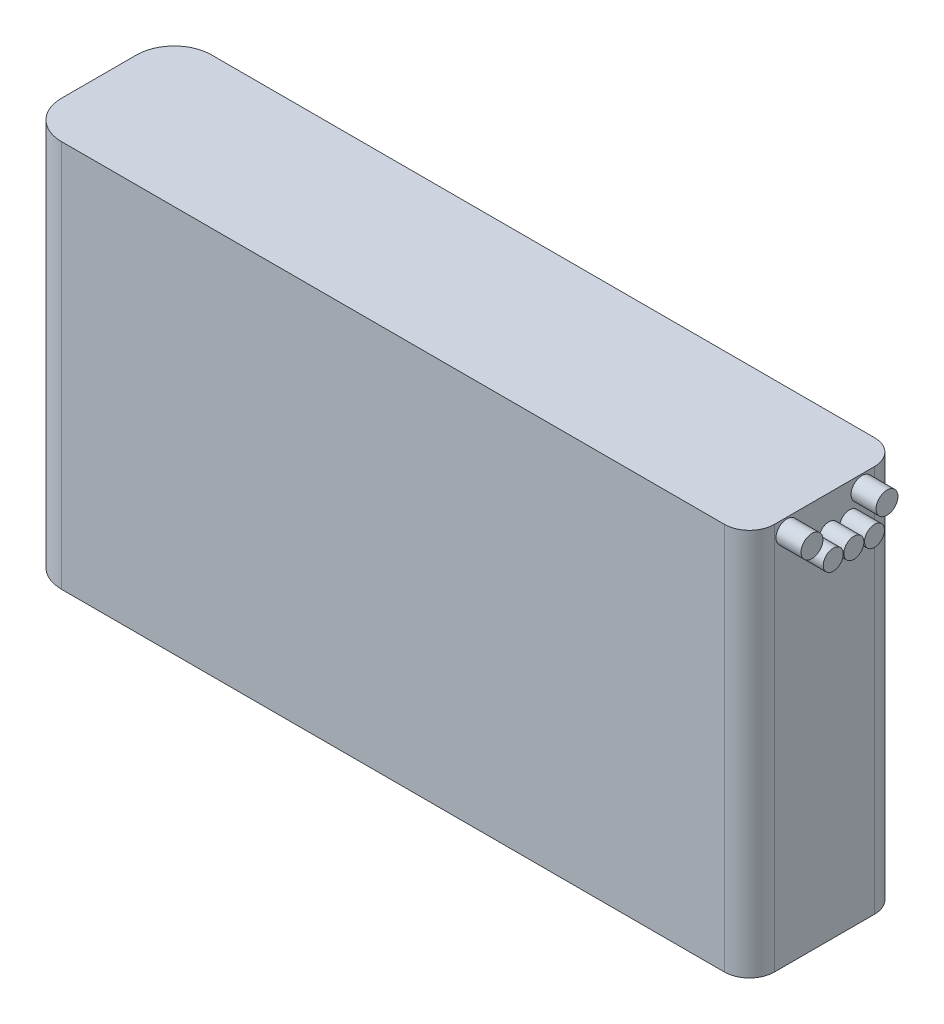
ISO-10303-21;
HEADER;
FILE_DESCRIPTION(('STEP AP214'),'2;1');
FILE_NAME('part.step','',(''),(''),'','','');
FILE_SCHEMA(('AUTOMOTIVE_DESIGN { 1 0 10303 214 1 1 1 1 }'));
ENDSEC;
DATA;
#1=APPLICATION_CONTEXT('core data for automotive mechanical design processes');
#2=APPLICATION_PROTOCOL_DEFINITION('international standard','automotive_design',2000,#1);
#3=PRODUCT_CONTEXT('',#1,'mechanical');
#4=PRODUCT('Part','Part','',(#3));
#5=PRODUCT_RELATED_PRODUCT_CATEGORY('part','',(#4));
#6=PRODUCT_DEFINITION_FORMATION('','',#4);
#7=PRODUCT_DEFINITION_CONTEXT('part definition',#1,'design');
#8=PRODUCT_DEFINITION('design','',#6,#7);
#9=PRODUCT_DEFINITION_SHAPE('','',#8);
#10=(LENGTH_UNIT() NAMED_UNIT(*) SI_UNIT(.MILLI.,.METRE.));
#11=(NAMED_UNIT(*) PLANE_ANGLE_UNIT() SI_UNIT($,.RADIAN.));
#12=(NAMED_UNIT(*) SI_UNIT($,.STERADIAN.) SOLID_ANGLE_UNIT());
#13=UNCERTAINTY_MEASURE_WITH_UNIT(LENGTH_MEASURE(1.E-05),#10,'distance_accuracy_value','');
#14=(GEOMETRIC_REPRESENTATION_CONTEXT(3) GLOBAL_UNCERTAINTY_ASSIGNED_CONTEXT((#13)) GLOBAL_UNIT_ASSIGNED_CONTEXT((#10,
#11,#12)) REPRESENTATION_CONTEXT('',''));
#15=CARTESIAN_POINT('',(0.,0.,0.));
#16=DIRECTION('',(0.,0.,1.));
#17=DIRECTION('',(1.,0.,0.));
#18=AXIS2_PLACEMENT_3D('',#15,#16,#17);
#19=CARTESIAN_POINT('',(0.,0.,12.));
#20=DIRECTION('',(1.,0.,0.));
#21=DIRECTION('',(0.,0.,-1.));
#22=AXIS2_PLACEMENT_3D('',#19,#20,#21);
#23=PLANE('',#22);
#24=DIRECTION('',(0.,0.,-1.));
#25=VECTOR('',#24,1.);
#26=CARTESIAN_POINT('',(0.,0.,12.));
#27=LINE('',#26,#25);
#28=CARTESIAN_POINT('',(0.,0.,9.));
#29=VERTEX_POINT('',#28);
#30=CARTESIAN_POINT('',(0.,0.,3.));
#31=VERTEX_POINT('',#30);
#32=EDGE_CURVE('E137',#29,#31,#27,.T.);
#33=ORIENTED_EDGE('',*,*,#32,.F.);
#34=DIRECTION('',(0.,-1.,0.));
#35=VECTOR('',#34,1.);
#36=CARTESIAN_POINT('',(0.,0.,9.));
#37=LINE('',#36,#35);
#38=CARTESIAN_POINT('',(0.,31.,9.));
#39=VERTEX_POINT('',#38);
#40=EDGE_CURVE('E174',#29,#39,#37,.F.);
#41=ORIENTED_EDGE('',*,*,#40,.T.);
#42=DIRECTION('',(0.,0.,-1.));
#43=VECTOR('',#42,1.);
#44=CARTESIAN_POINT('',(0.,31.,12.));
#45=LINE('',#44,#43);
#46=CARTESIAN_POINT('',(0.,31.,3.));
#47=VERTEX_POINT('',#46);
#48=EDGE_CURVE('E130',#39,#47,#45,.T.);
#49=ORIENTED_EDGE('',*,*,#48,.T.);
#50=DIRECTION('',(0.,-1.,0.));
#51=VECTOR('',#50,1.);
#52=CARTESIAN_POINT('',(0.,0.,3.));
#53=LINE('',#52,#51);
#54=EDGE_CURVE('E170',#47,#31,#53,.T.);
#55=ORIENTED_EDGE('',*,*,#54,.T.);
#56=EDGE_LOOP('',(#33,#41,#49,#55));
#57=FACE_BOUND('',#56,.T.);
#58=ADVANCED_FACE('F39',(#57),#23,.F.);
#59=CARTESIAN_POINT('',(0.,0.,12.));
#60=DIRECTION('',(0.,1.,0.));
#61=DIRECTION('',(0.,0.,1.));
#62=AXIS2_PLACEMENT_3D('',#59,#60,#61);
#63=PLANE('',#62);
#64=DIRECTION('',(1.,0.,0.));
#65=VECTOR('',#64,1.);
#66=CARTESIAN_POINT('',(0.,0.,12.));
#67=LINE('',#66,#65);
#68=CARTESIAN_POINT('',(3.,0.,12.));
#69=VERTEX_POINT('',#68);
#70=CARTESIAN_POINT('',(56.,0.,12.));
#71=VERTEX_POINT('',#70);
#72=EDGE_CURVE('E255',#69,#71,#67,.T.);
#73=ORIENTED_EDGE('',*,*,#72,.F.);
#74=CARTESIAN_POINT('',(3.,0.,9.));
#75=DIRECTION('',(0.,1.,0.));
#76=DIRECTION('',(0.,0.,1.));
#77=AXIS2_PLACEMENT_3D('',#74,#75,#76);
#78=CIRCLE('',#77,3.);
#79=EDGE_CURVE('E167',#69,#29,#78,.F.);
#80=ORIENTED_EDGE('',*,*,#79,.T.);
#81=ORIENTED_EDGE('',*,*,#32,.T.);
#82=CARTESIAN_POINT('',(3.,0.,3.));
#83=DIRECTION('',(0.,1.,0.));
#84=DIRECTION('',(0.,0.,1.));
#85=AXIS2_PLACEMENT_3D('',#82,#83,#84);
#86=CIRCLE('',#85,3.);
#87=CARTESIAN_POINT('',(3.,0.,0.));
#88=VERTEX_POINT('',#87);
#89=EDGE_CURVE('E164',#31,#88,#86,.F.);
#90=ORIENTED_EDGE('',*,*,#89,.T.);
#91=DIRECTION('',(1.,0.,0.));
#92=VECTOR('',#91,1.);
#93=CARTESIAN_POINT('',(0.,0.,0.));
#94=LINE('',#93,#92);
#95=CARTESIAN_POINT('',(56.,0.,0.));
#96=VERTEX_POINT('',#95);
#97=EDGE_CURVE('E264',#88,#96,#94,.T.);
#98=ORIENTED_EDGE('',*,*,#97,.T.);
#99=CARTESIAN_POINT('',(56.,0.,2.));
#100=DIRECTION('',(0.,1.,0.));
#101=DIRECTION('',(0.,0.,1.));
#102=AXIS2_PLACEMENT_3D('',#99,#100,#101);
#103=CIRCLE('',#102,2.);
#104=CARTESIAN_POINT('',(58.,0.,2.));
#105=VERTEX_POINT('',#104);
#106=EDGE_CURVE('E154',#96,#105,#103,.F.);
#107=ORIENTED_EDGE('',*,*,#106,.T.);
#108=DIRECTION('',(0.,0.,-1.));
#109=VECTOR('',#108,1.);
#110=CARTESIAN_POINT('',(58.,0.,12.));
#111=LINE('',#110,#109);
#112=CARTESIAN_POINT('',(58.,0.,10.));
#113=VERTEX_POINT('',#112);
#114=EDGE_CURVE('E129',#113,#105,#111,.T.);
#115=ORIENTED_EDGE('',*,*,#114,.F.);
#116=CARTESIAN_POINT('',(56.,0.,10.));
#117=DIRECTION('',(0.,1.,0.));
#118=DIRECTION('',(0.,0.,1.));
#119=AXIS2_PLACEMENT_3D('',#116,#117,#118);
#120=CIRCLE('',#119,2.);
#121=EDGE_CURVE('E135',#113,#71,#120,.F.);
#122=ORIENTED_EDGE('',*,*,#121,.T.);
#123=EDGE_LOOP('',(#73,#80,#81,#90,#98,#107,#115,#122));
#124=FACE_BOUND('',#123,.T.);
#125=ADVANCED_FACE('F203',(#124),#63,.F.);
#126=CARTESIAN_POINT('',(58.,0.,12.));
#127=DIRECTION('',(-1.,0.,0.));
#128=DIRECTION('',(0.,0.,1.));
#129=AXIS2_PLACEMENT_3D('',#126,#127,#128);
#130=PLANE('',#129);
#131=CARTESIAN_POINT('',(58.,28.2,7.3));
#132=DIRECTION('',(-1.,0.,0.));
#133=DIRECTION('',(0.,0.,1.));
#134=AXIS2_PLACEMENT_3D('',#131,#132,#133);
#135=CIRCLE('',#134,0.799999999999999);
#136=CARTESIAN_POINT('',(58.,28.2,8.1));
#137=VERTEX_POINT('',#136);
#138=EDGE_CURVE('E11',#137,#137,#135,.F.);
#139=ORIENTED_EDGE('',*,*,#138,.F.);
#140=EDGE_LOOP('',(#139));
#141=FACE_BOUND('',#140,.T.);
#142=CARTESIAN_POINT('',(58.,28.2,4.));
#143=DIRECTION('',(-1.,0.,0.));
#144=DIRECTION('',(0.,0.,1.));
#145=AXIS2_PLACEMENT_3D('',#142,#143,#144);
#146=CIRCLE('',#145,0.799999999999997);
#147=CARTESIAN_POINT('',(58.,28.2,4.8));
#148=VERTEX_POINT('',#147);
#149=EDGE_CURVE('E48',#148,#148,#146,.F.);
#150=ORIENTED_EDGE('',*,*,#149,.F.);
#151=EDGE_LOOP('',(#150));
#152=FACE_BOUND('',#151,.T.);
#153=CARTESIAN_POINT('',(58.,28.2,5.65));
#154=DIRECTION('',(-1.,0.,0.));
#155=DIRECTION('',(0.,0.,1.));
#156=AXIS2_PLACEMENT_3D('',#153,#154,#155);
#157=CIRCLE('',#156,0.799999999999998);
#158=CARTESIAN_POINT('',(58.,28.2,6.45));
#159=VERTEX_POINT('',#158);
#160=EDGE_CURVE('E192',#159,#159,#157,.F.);
#161=ORIENTED_EDGE('',*,*,#160,.F.);
#162=EDGE_LOOP('',(#161));
#163=FACE_BOUND('',#162,.T.);
#164=CARTESIAN_POINT('',(58.,30.,3.));
#165=DIRECTION('',(-1.,0.,0.));
#166=DIRECTION('',(0.,0.,1.));
#167=AXIS2_PLACEMENT_3D('',#164,#165,#166);
#168=CIRCLE('',#167,0.875000000000002);
#169=CARTESIAN_POINT('',(58.,30.,3.875));
#170=VERTEX_POINT('',#169);
#171=EDGE_CURVE('E188',#170,#170,#168,.F.);
#172=ORIENTED_EDGE('',*,*,#171,.F.);
#173=EDGE_LOOP('',(#172));
#174=FACE_BOUND('',#173,.T.);
#175=CARTESIAN_POINT('',(58.,30.,9.));
#176=DIRECTION('',(-1.,0.,0.));
#177=DIRECTION('',(0.,0.,1.));
#178=AXIS2_PLACEMENT_3D('',#175,#176,#177);
#179=CIRCLE('',#178,0.875);
#180=CARTESIAN_POINT('',(58.,30.,9.875));
#181=VERTEX_POINT('',#180);
#182=EDGE_CURVE('E184',#181,#181,#179,.F.);
#183=ORIENTED_EDGE('',*,*,#182,.F.);
#184=EDGE_LOOP('',(#183));
#185=FACE_BOUND('',#184,.T.);
#186=ORIENTED_EDGE('',*,*,#114,.T.);
#187=DIRECTION('',(0.,1.,0.));
#188=VECTOR('',#187,1.);
#189=CARTESIAN_POINT('',(58.,31.,2.));
#190=LINE('',#189,#188);
#191=CARTESIAN_POINT('',(58.,31.,2.));
#192=VERTEX_POINT('',#191);
#193=EDGE_CURVE('E119',#105,#192,#190,.T.);
#194=ORIENTED_EDGE('',*,*,#193,.T.);
#195=DIRECTION('',(0.,0.,-1.));
#196=VECTOR('',#195,1.);
#197=CARTESIAN_POINT('',(58.,31.,12.));
#198=LINE('',#197,#196);
#199=CARTESIAN_POINT('',(58.,31.,10.));
#200=VERTEX_POINT('',#199);
#201=EDGE_CURVE('E110',#200,#192,#198,.T.);
#202=ORIENTED_EDGE('',*,*,#201,.F.);
#203=DIRECTION('',(0.,1.,0.));
#204=VECTOR('',#203,1.);
#205=CARTESIAN_POINT('',(58.,0.,10.));
#206=LINE('',#205,#204);
#207=EDGE_CURVE('E125',#200,#113,#206,.F.);
#208=ORIENTED_EDGE('',*,*,#207,.T.);
#209=EDGE_LOOP('',(#186,#194,#202,#208));
#210=FACE_BOUND('',#209,.T.);
#211=ADVANCED_FACE('F124',(#141,#152,#163,#174,#185,#210),#130,.F.);
#212=CARTESIAN_POINT('',(0.,31.,12.));
#213=DIRECTION('',(0.,-1.,0.));
#214=DIRECTION('',(0.,0.,-1.));
#215=AXIS2_PLACEMENT_3D('',#212,#213,#214);
#216=PLANE('',#215);
#217=ORIENTED_EDGE('',*,*,#48,.F.);
#218=CARTESIAN_POINT('',(3.,31.,9.));
#219=DIRECTION('',(0.,-1.,0.));
#220=DIRECTION('',(0.,0.,-1.));
#221=AXIS2_PLACEMENT_3D('',#218,#219,#220);
#222=CIRCLE('',#221,3.);
#223=CARTESIAN_POINT('',(3.,31.,12.));
#224=VERTEX_POINT('',#223);
#225=EDGE_CURVE('E179',#39,#224,#222,.F.);
#226=ORIENTED_EDGE('',*,*,#225,.T.);
#227=DIRECTION('',(-1.,0.,0.));
#228=VECTOR('',#227,1.);
#229=CARTESIAN_POINT('',(0.,31.,12.));
#230=LINE('',#229,#228);
#231=CARTESIAN_POINT('',(56.,31.,12.));
#232=VERTEX_POINT('',#231);
#233=EDGE_CURVE('E112',#232,#224,#230,.T.);
#234=ORIENTED_EDGE('',*,*,#233,.F.);
#235=CARTESIAN_POINT('',(56.,31.,10.));
#236=DIRECTION('',(0.,-1.,0.));
#237=DIRECTION('',(0.,0.,-1.));
#238=AXIS2_PLACEMENT_3D('',#235,#236,#237);
#239=CIRCLE('',#238,2.);
#240=EDGE_CURVE('E107',#232,#200,#239,.F.);
#241=ORIENTED_EDGE('',*,*,#240,.T.);
#242=ORIENTED_EDGE('',*,*,#201,.T.);
#243=CARTESIAN_POINT('',(56.,31.,2.));
#244=DIRECTION('',(0.,-1.,0.));
#245=DIRECTION('',(0.,0.,-1.));
#246=AXIS2_PLACEMENT_3D('',#243,#244,#245);
#247=CIRCLE('',#246,2.);
#248=CARTESIAN_POINT('',(56.,31.,0.));
#249=VERTEX_POINT('',#248);
#250=EDGE_CURVE('E118',#192,#249,#247,.F.);
#251=ORIENTED_EDGE('',*,*,#250,.T.);
#252=DIRECTION('',(-1.,0.,0.));
#253=VECTOR('',#252,1.);
#254=CARTESIAN_POINT('',(0.,31.,0.));
#255=LINE('',#254,#253);
#256=CARTESIAN_POINT('',(3.,31.,0.));
#257=VERTEX_POINT('',#256);
#258=EDGE_CURVE('E260',#249,#257,#255,.T.);
#259=ORIENTED_EDGE('',*,*,#258,.T.);
#260=CARTESIAN_POINT('',(3.,31.,3.));
#261=DIRECTION('',(0.,-1.,0.));
#262=DIRECTION('',(0.,0.,-1.));
#263=AXIS2_PLACEMENT_3D('',#260,#261,#262);
#264=CIRCLE('',#263,3.);
#265=EDGE_CURVE('E62',#257,#47,#264,.F.);
#266=ORIENTED_EDGE('',*,*,#265,.T.);
#267=EDGE_LOOP('',(#217,#226,#234,#241,#242,#251,#259,#266));
#268=FACE_BOUND('',#267,.T.);
#269=ADVANCED_FACE('F109',(#268),#216,.F.);
#270=CARTESIAN_POINT('',(0.,0.,12.));
#271=DIRECTION('',(0.,0.,-1.));
#272=DIRECTION('',(-1.,0.,0.));
#273=AXIS2_PLACEMENT_3D('',#270,#271,#272);
#274=PLANE('',#273);
#275=ORIENTED_EDGE('',*,*,#233,.T.);
#276=DIRECTION('',(0.,-1.,0.));
#277=VECTOR('',#276,1.);
#278=CARTESIAN_POINT('',(3.,0.,12.));
#279=LINE('',#278,#277);
#280=EDGE_CURVE('E160',#224,#69,#279,.T.);
#281=ORIENTED_EDGE('',*,*,#280,.T.);
#282=ORIENTED_EDGE('',*,*,#72,.T.);
#283=DIRECTION('',(0.,1.,0.));
#284=VECTOR('',#283,1.);
#285=CARTESIAN_POINT('',(56.,0.,12.));
#286=LINE('',#285,#284);
#287=EDGE_CURVE('E157',#71,#232,#286,.T.);
#288=ORIENTED_EDGE('',*,*,#287,.T.);
#289=EDGE_LOOP('',(#275,#281,#282,#288));
#290=FACE_BOUND('',#289,.T.);
#291=ADVANCED_FACE('F252',(#290),#274,.F.);
#292=CARTESIAN_POINT('',(0.,0.,0.));
#293=DIRECTION('',(0.,0.,-1.));
#294=DIRECTION('',(-1.,0.,0.));
#295=AXIS2_PLACEMENT_3D('',#292,#293,#294);
#296=PLANE('',#295);
#297=ORIENTED_EDGE('',*,*,#97,.F.);
#298=DIRECTION('',(0.,-1.,0.));
#299=VECTOR('',#298,1.);
#300=CARTESIAN_POINT('',(3.,31.,0.));
#301=LINE('',#300,#299);
#302=EDGE_CURVE('E55',#88,#257,#301,.F.);
#303=ORIENTED_EDGE('',*,*,#302,.T.);
#304=ORIENTED_EDGE('',*,*,#258,.F.);
#305=DIRECTION('',(0.,1.,0.));
#306=VECTOR('',#305,1.);
#307=CARTESIAN_POINT('',(56.,0.,0.));
#308=LINE('',#307,#306);
#309=EDGE_CURVE('E148',#249,#96,#308,.F.);
#310=ORIENTED_EDGE('',*,*,#309,.T.);
#311=EDGE_LOOP('',(#297,#303,#304,#310));
#312=FACE_BOUND('',#311,.T.);
#313=ADVANCED_FACE('F241',(#312),#296,.T.);
#314=CARTESIAN_POINT('',(56.,0.,2.));
#315=DIRECTION('',(0.,-1.,0.));
#316=DIRECTION('',(0.,0.,-1.));
#317=AXIS2_PLACEMENT_3D('',#314,#315,#316);
#318=CYLINDRICAL_SURFACE('',#317,2.);
#319=ORIENTED_EDGE('',*,*,#106,.F.);
#320=ORIENTED_EDGE('',*,*,#309,.F.);
#321=ORIENTED_EDGE('',*,*,#250,.F.);
#322=ORIENTED_EDGE('',*,*,#193,.F.);
#323=EDGE_LOOP('',(#319,#320,#321,#322));
#324=FACE_BOUND('',#323,.T.);
#325=ADVANCED_FACE('F238',(#324),#318,.T.);
#326=CARTESIAN_POINT('',(56.,0.,10.));
#327=DIRECTION('',(0.,1.,0.));
#328=DIRECTION('',(0.,0.,1.));
#329=AXIS2_PLACEMENT_3D('',#326,#327,#328);
#330=CYLINDRICAL_SURFACE('',#329,2.);
#331=ORIENTED_EDGE('',*,*,#121,.F.);
#332=ORIENTED_EDGE('',*,*,#207,.F.);
#333=ORIENTED_EDGE('',*,*,#240,.F.);
#334=ORIENTED_EDGE('',*,*,#287,.F.);
#335=EDGE_LOOP('',(#331,#332,#333,#334));
#336=FACE_BOUND('',#335,.T.);
#337=ADVANCED_FACE('F133',(#336),#330,.T.);
#338=CARTESIAN_POINT('',(3.,0.,9.));
#339=DIRECTION('',(0.,-1.,0.));
#340=DIRECTION('',(0.,0.,-1.));
#341=AXIS2_PLACEMENT_3D('',#338,#339,#340);
#342=CYLINDRICAL_SURFACE('',#341,3.);
#343=ORIENTED_EDGE('',*,*,#225,.F.);
#344=ORIENTED_EDGE('',*,*,#40,.F.);
#345=ORIENTED_EDGE('',*,*,#79,.F.);
#346=ORIENTED_EDGE('',*,*,#280,.F.);
#347=EDGE_LOOP('',(#343,#344,#345,#346));
#348=FACE_BOUND('',#347,.T.);
#349=ADVANCED_FACE('F224',(#348),#342,.T.);
#350=CARTESIAN_POINT('',(3.,0.,3.));
#351=DIRECTION('',(0.,1.,0.));
#352=DIRECTION('',(0.,0.,1.));
#353=AXIS2_PLACEMENT_3D('',#350,#351,#352);
#354=CYLINDRICAL_SURFACE('',#353,3.);
#355=ORIENTED_EDGE('',*,*,#265,.F.);
#356=ORIENTED_EDGE('',*,*,#302,.F.);
#357=ORIENTED_EDGE('',*,*,#89,.F.);
#358=ORIENTED_EDGE('',*,*,#54,.F.);
#359=EDGE_LOOP('',(#355,#356,#357,#358));
#360=FACE_BOUND('',#359,.T.);
#361=ADVANCED_FACE('F41',(#360),#354,.T.);
#362=CARTESIAN_POINT('',(60.,30.,9.));
#363=DIRECTION('',(-1.,0.,0.));
#364=DIRECTION('',(0.,0.,1.));
#365=AXIS2_PLACEMENT_3D('',#362,#363,#364);
#366=CYLINDRICAL_SURFACE('',#365,0.875);
#367=CARTESIAN_POINT('',(60.,30.,9.));
#368=DIRECTION('',(1.,0.,0.));
#369=DIRECTION('',(0.,0.,-1.));
#370=AXIS2_PLACEMENT_3D('',#367,#368,#369);
#371=CIRCLE('',#370,0.875);
#372=CARTESIAN_POINT('',(60.,30.,8.125));
#373=VERTEX_POINT('',#372);
#374=EDGE_CURVE('E267',#373,#373,#371,.T.);
#375=ORIENTED_EDGE('',*,*,#374,.F.);
#376=EDGE_LOOP('',(#375));
#377=FACE_BOUND('',#376,.T.);
#378=ORIENTED_EDGE('',*,*,#182,.T.);
#379=EDGE_LOOP('',(#378));
#380=FACE_BOUND('',#379,.T.);
#381=ADVANCED_FACE('F212',(#377,#380),#366,.T.);
#382=CARTESIAN_POINT('',(60.,30.,9.));
#383=DIRECTION('',(1.,0.,0.));
#384=DIRECTION('',(0.,0.,-1.));
#385=AXIS2_PLACEMENT_3D('',#382,#383,#384);
#386=PLANE('',#385);
#387=ORIENTED_EDGE('',*,*,#374,.T.);
#388=EDGE_LOOP('',(#387));
#389=FACE_BOUND('',#388,.T.);
#390=ADVANCED_FACE('F214',(#389),#386,.T.);
#391=CARTESIAN_POINT('',(60.,30.,3.));
#392=DIRECTION('',(-1.,0.,0.));
#393=DIRECTION('',(0.,0.,1.));
#394=AXIS2_PLACEMENT_3D('',#391,#392,#393);
#395=CYLINDRICAL_SURFACE('',#394,0.875000000000002);
#396=CARTESIAN_POINT('',(60.,30.,3.));
#397=DIRECTION('',(1.,0.,0.));
#398=DIRECTION('',(0.,0.,-1.));
#399=AXIS2_PLACEMENT_3D('',#396,#397,#398);
#400=CIRCLE('',#399,0.875000000000002);
#401=CARTESIAN_POINT('',(60.,30.,2.125));
#402=VERTEX_POINT('',#401);
#403=EDGE_CURVE('E416',#402,#402,#400,.T.);
#404=ORIENTED_EDGE('',*,*,#403,.F.);
#405=EDGE_LOOP('',(#404));
#406=FACE_BOUND('',#405,.T.);
#407=ORIENTED_EDGE('',*,*,#171,.T.);
#408=EDGE_LOOP('',(#407));
#409=FACE_BOUND('',#408,.T.);
#410=ADVANCED_FACE('F221',(#406,#409),#395,.T.);
#411=CARTESIAN_POINT('',(60.,30.,3.));
#412=DIRECTION('',(1.,0.,0.));
#413=DIRECTION('',(0.,0.,-1.));
#414=AXIS2_PLACEMENT_3D('',#411,#412,#413);
#415=PLANE('',#414);
#416=ORIENTED_EDGE('',*,*,#403,.T.);
#417=EDGE_LOOP('',(#416));
#418=FACE_BOUND('',#417,.T.);
#419=ADVANCED_FACE('F329',(#418),#415,.T.);
#420=CARTESIAN_POINT('',(60.,28.2,5.65));
#421=DIRECTION('',(-1.,0.,0.));
#422=DIRECTION('',(0.,0.,1.));
#423=AXIS2_PLACEMENT_3D('',#420,#421,#422);
#424=CYLINDRICAL_SURFACE('',#423,0.799999999999998);
#425=CARTESIAN_POINT('',(60.,28.2,5.65));
#426=DIRECTION('',(1.,0.,0.));
#427=DIRECTION('',(0.,0.,-1.));
#428=AXIS2_PLACEMENT_3D('',#425,#426,#427);
#429=CIRCLE('',#428,0.799999999999998);
#430=CARTESIAN_POINT('',(60.,28.2,4.85));
#431=VERTEX_POINT('',#430);
#432=EDGE_CURVE('E410',#431,#431,#429,.T.);
#433=ORIENTED_EDGE('',*,*,#432,.F.);
#434=EDGE_LOOP('',(#433));
#435=FACE_BOUND('',#434,.T.);
#436=ORIENTED_EDGE('',*,*,#160,.T.);
#437=EDGE_LOOP('',(#436));
#438=FACE_BOUND('',#437,.T.);
#439=ADVANCED_FACE('F339',(#435,#438),#424,.T.);
#440=CARTESIAN_POINT('',(60.,28.2,5.65));
#441=DIRECTION('',(1.,0.,0.));
#442=DIRECTION('',(0.,0.,-1.));
#443=AXIS2_PLACEMENT_3D('',#440,#441,#442);
#444=PLANE('',#443);
#445=ORIENTED_EDGE('',*,*,#432,.T.);
#446=EDGE_LOOP('',(#445));
#447=FACE_BOUND('',#446,.T.);
#448=ADVANCED_FACE('F349',(#447),#444,.T.);
#449=CARTESIAN_POINT('',(60.,28.2,4.));
#450=DIRECTION('',(-1.,0.,0.));
#451=DIRECTION('',(0.,0.,1.));
#452=AXIS2_PLACEMENT_3D('',#449,#450,#451);
#453=CYLINDRICAL_SURFACE('',#452,0.799999999999997);
#454=CARTESIAN_POINT('',(60.,28.2,4.));
#455=DIRECTION('',(1.,0.,0.));
#456=DIRECTION('',(0.,0.,-1.));
#457=AXIS2_PLACEMENT_3D('',#454,#455,#456);
#458=CIRCLE('',#457,0.799999999999997);
#459=CARTESIAN_POINT('',(60.,28.2,3.2));
#460=VERTEX_POINT('',#459);
#461=EDGE_CURVE('E406',#460,#460,#458,.T.);
#462=ORIENTED_EDGE('',*,*,#461,.F.);
#463=EDGE_LOOP('',(#462));
#464=FACE_BOUND('',#463,.T.);
#465=ORIENTED_EDGE('',*,*,#149,.T.);
#466=EDGE_LOOP('',(#465));
#467=FACE_BOUND('',#466,.T.);
#468=ADVANCED_FACE('F199',(#464,#467),#453,.T.);
#469=CARTESIAN_POINT('',(60.,28.2,4.));
#470=DIRECTION('',(1.,0.,0.));
#471=DIRECTION('',(0.,0.,-1.));
#472=AXIS2_PLACEMENT_3D('',#469,#470,#471);
#473=PLANE('',#472);
#474=ORIENTED_EDGE('',*,*,#461,.T.);
#475=EDGE_LOOP('',(#474));
#476=FACE_BOUND('',#475,.T.);
#477=ADVANCED_FACE('F368',(#476),#473,.T.);
#478=CARTESIAN_POINT('',(60.,28.2,7.3));
#479=DIRECTION('',(-1.,0.,0.));
#480=DIRECTION('',(0.,0.,1.));
#481=AXIS2_PLACEMENT_3D('',#478,#479,#480);
#482=CYLINDRICAL_SURFACE('',#481,0.799999999999999);
#483=CARTESIAN_POINT('',(60.,28.2,7.3));
#484=DIRECTION('',(1.,0.,0.));
#485=DIRECTION('',(0.,0.,-1.));
#486=AXIS2_PLACEMENT_3D('',#483,#484,#485);
#487=CIRCLE('',#486,0.799999999999999);
#488=CARTESIAN_POINT('',(60.,28.2,6.5));
#489=VERTEX_POINT('',#488);
#490=EDGE_CURVE('E404',#489,#489,#487,.T.);
#491=ORIENTED_EDGE('',*,*,#490,.F.);
#492=EDGE_LOOP('',(#491));
#493=FACE_BOUND('',#492,.T.);
#494=ORIENTED_EDGE('',*,*,#138,.T.);
#495=EDGE_LOOP('',(#494));
#496=FACE_BOUND('',#495,.T.);
#497=ADVANCED_FACE('F378',(#493,#496),#482,.T.);
#498=CARTESIAN_POINT('',(60.,28.2,7.3));
#499=DIRECTION('',(1.,0.,0.));
#500=DIRECTION('',(0.,0.,-1.));
#501=AXIS2_PLACEMENT_3D('',#498,#499,#500);
#502=PLANE('',#501);
#503=ORIENTED_EDGE('',*,*,#490,.T.);
#504=EDGE_LOOP('',(#503));
#505=FACE_BOUND('',#504,.T.);
#506=ADVANCED_FACE('F388',(#505),#502,.T.);
#507=CLOSED_SHELL('',(#58,#125,#211,#269,#291,#313,#325,#337,#349,#361,#381,#390,#410,#419,#439,
#448,#468,#477,#497,#506));
#508=MANIFOLD_SOLID_BREP('B2',#507);
#509=ADVANCED_BREP_SHAPE_REPRESENTATION('',(#18,#508),#14);
#510=SHAPE_DEFINITION_REPRESENTATION(#9,#509);
ENDSEC;
END-ISO-10303-21;
